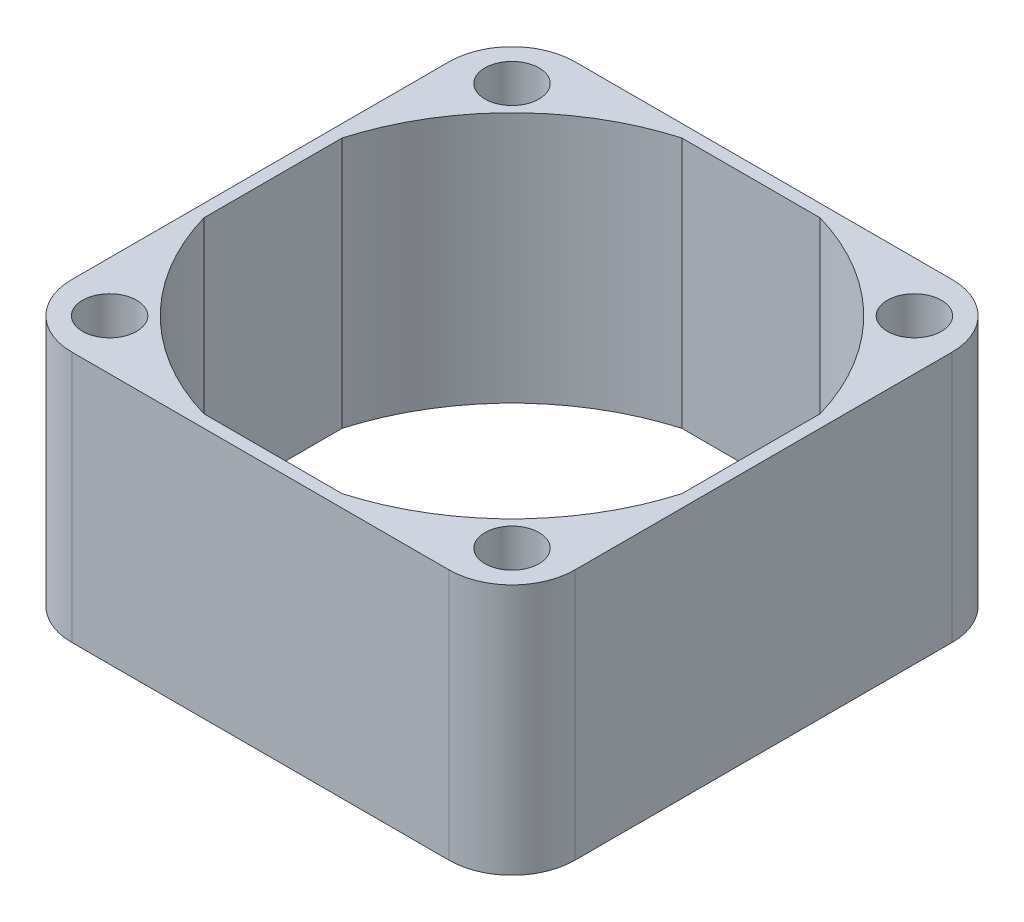
ISO-10303-21;
HEADER;
FILE_DESCRIPTION(('STEP AP214'),'2;1');
FILE_NAME('part.step','',(''),(''),'','','');
FILE_SCHEMA(('AUTOMOTIVE_DESIGN { 1 0 10303 214 1 1 1 1 }'));
ENDSEC;
DATA;
#1=APPLICATION_CONTEXT('core data for automotive mechanical design processes');
#2=APPLICATION_PROTOCOL_DEFINITION('international standard','automotive_design',2000,#1);
#3=PRODUCT_CONTEXT('',#1,'mechanical');
#4=PRODUCT('Part','Part','',(#3));
#5=PRODUCT_RELATED_PRODUCT_CATEGORY('part','',(#4));
#6=PRODUCT_DEFINITION_FORMATION('','',#4);
#7=PRODUCT_DEFINITION_CONTEXT('part definition',#1,'design');
#8=PRODUCT_DEFINITION('design','',#6,#7);
#9=PRODUCT_DEFINITION_SHAPE('','',#8);
#10=(LENGTH_UNIT() NAMED_UNIT(*) SI_UNIT(.MILLI.,.METRE.));
#11=(NAMED_UNIT(*) PLANE_ANGLE_UNIT() SI_UNIT($,.RADIAN.));
#12=(NAMED_UNIT(*) SI_UNIT($,.STERADIAN.) SOLID_ANGLE_UNIT());
#13=UNCERTAINTY_MEASURE_WITH_UNIT(LENGTH_MEASURE(1.E-05),#10,'distance_accuracy_value','');
#14=(GEOMETRIC_REPRESENTATION_CONTEXT(3) GLOBAL_UNCERTAINTY_ASSIGNED_CONTEXT((#13)) GLOBAL_UNIT_ASSIGNED_CONTEXT((#10,
#11,#12)) REPRESENTATION_CONTEXT('',''));
#15=CARTESIAN_POINT('',(0.,0.,0.));
#16=DIRECTION('',(0.,0.,1.));
#17=DIRECTION('',(1.,0.,0.));
#18=AXIS2_PLACEMENT_3D('',#15,#16,#17);
#19=CARTESIAN_POINT('',(0.,20.,0.));
#20=DIRECTION('',(0.,1.,0.));
#21=DIRECTION('',(0.,0.,1.));
#22=AXIS2_PLACEMENT_3D('',#19,#20,#21);
#23=PLANE('',#22);
#24=CARTESIAN_POINT('',(-16.,20.,16.));
#25=DIRECTION('',(0.,1.,0.));
#26=DIRECTION('',(0.,0.,1.));
#27=AXIS2_PLACEMENT_3D('',#24,#25,#26);
#28=CIRCLE('',#27,2.15);
#29=CARTESIAN_POINT('',(-16.,20.,18.15));
#30=VERTEX_POINT('',#29);
#31=EDGE_CURVE('E228',#30,#30,#28,.T.);
#32=ORIENTED_EDGE('',*,*,#31,.F.);
#33=EDGE_LOOP('',(#32));
#34=FACE_BOUND('',#33,.T.);
#35=CARTESIAN_POINT('',(16.,20.,-16.));
#36=DIRECTION('',(0.,1.,0.));
#37=DIRECTION('',(0.,0.,1.));
#38=AXIS2_PLACEMENT_3D('',#35,#36,#37);
#39=CIRCLE('',#38,2.15);
#40=CARTESIAN_POINT('',(16.,20.,-13.85));
#41=VERTEX_POINT('',#40);
#42=EDGE_CURVE('E240',#41,#41,#39,.T.);
#43=ORIENTED_EDGE('',*,*,#42,.F.);
#44=EDGE_LOOP('',(#43));
#45=FACE_BOUND('',#44,.T.);
#46=DIRECTION('',(0.,0.,1.));
#47=VECTOR('',#46,1.);
#48=CARTESIAN_POINT('',(-20.,20.,-20.));
#49=LINE('',#48,#47);
#50=CARTESIAN_POINT('',(-20.,20.,-15.));
#51=VERTEX_POINT('',#50);
#52=CARTESIAN_POINT('',(-20.,20.,15.));
#53=VERTEX_POINT('',#52);
#54=EDGE_CURVE('E251',#51,#53,#49,.T.);
#55=ORIENTED_EDGE('',*,*,#54,.T.);
#56=CARTESIAN_POINT('',(-15.,20.,15.));
#57=DIRECTION('',(0.,1.,0.));
#58=DIRECTION('',(0.,0.,1.));
#59=AXIS2_PLACEMENT_3D('',#56,#57,#58);
#60=CIRCLE('',#59,5.);
#61=CARTESIAN_POINT('',(-15.,20.,20.));
#62=VERTEX_POINT('',#61);
#63=EDGE_CURVE('E289',#53,#62,#60,.T.);
#64=ORIENTED_EDGE('',*,*,#63,.T.);
#65=DIRECTION('',(1.,0.,0.));
#66=VECTOR('',#65,1.);
#67=CARTESIAN_POINT('',(-20.,20.,20.));
#68=LINE('',#67,#66);
#69=CARTESIAN_POINT('',(15.,20.,20.));
#70=VERTEX_POINT('',#69);
#71=EDGE_CURVE('E254',#62,#70,#68,.T.);
#72=ORIENTED_EDGE('',*,*,#71,.T.);
#73=CARTESIAN_POINT('',(15.,20.,15.));
#74=DIRECTION('',(0.,1.,0.));
#75=DIRECTION('',(0.,0.,1.));
#76=AXIS2_PLACEMENT_3D('',#73,#74,#75);
#77=CIRCLE('',#76,5.);
#78=CARTESIAN_POINT('',(20.,20.,15.));
#79=VERTEX_POINT('',#78);
#80=EDGE_CURVE('E287',#70,#79,#77,.T.);
#81=ORIENTED_EDGE('',*,*,#80,.T.);
#82=DIRECTION('',(0.,0.,-1.));
#83=VECTOR('',#82,1.);
#84=CARTESIAN_POINT('',(20.,20.,-20.));
#85=LINE('',#84,#83);
#86=CARTESIAN_POINT('',(20.,20.,-15.));
#87=VERTEX_POINT('',#86);
#88=EDGE_CURVE('E246',#79,#87,#85,.T.);
#89=ORIENTED_EDGE('',*,*,#88,.T.);
#90=CARTESIAN_POINT('',(15.,20.,-15.));
#91=DIRECTION('',(0.,1.,0.));
#92=DIRECTION('',(0.,0.,1.));
#93=AXIS2_PLACEMENT_3D('',#90,#91,#92);
#94=CIRCLE('',#93,5.);
#95=CARTESIAN_POINT('',(15.,20.,-20.));
#96=VERTEX_POINT('',#95);
#97=EDGE_CURVE('E58',#87,#96,#94,.T.);
#98=ORIENTED_EDGE('',*,*,#97,.T.);
#99=DIRECTION('',(-1.,0.,0.));
#100=VECTOR('',#99,1.);
#101=CARTESIAN_POINT('',(-20.,20.,-20.));
#102=LINE('',#101,#100);
#103=CARTESIAN_POINT('',(-15.,20.,-20.));
#104=VERTEX_POINT('',#103);
#105=EDGE_CURVE('E248',#96,#104,#102,.T.);
#106=ORIENTED_EDGE('',*,*,#105,.T.);
#107=CARTESIAN_POINT('',(-15.,20.,-15.));
#108=DIRECTION('',(0.,1.,0.));
#109=DIRECTION('',(0.,0.,1.));
#110=AXIS2_PLACEMENT_3D('',#107,#108,#109);
#111=CIRCLE('',#110,5.);
#112=EDGE_CURVE('E284',#104,#51,#111,.T.);
#113=ORIENTED_EDGE('',*,*,#112,.T.);
#114=EDGE_LOOP('',(#55,#64,#72,#81,#89,#98,#106,#113));
#115=FACE_BOUND('',#114,.T.);
#116=CARTESIAN_POINT('',(16.,20.,16.));
#117=DIRECTION('',(0.,1.,0.));
#118=DIRECTION('',(0.,0.,1.));
#119=AXIS2_PLACEMENT_3D('',#116,#117,#118);
#120=CIRCLE('',#119,2.15);
#121=CARTESIAN_POINT('',(16.,20.,18.15));
#122=VERTEX_POINT('',#121);
#123=EDGE_CURVE('E234',#122,#122,#120,.T.);
#124=ORIENTED_EDGE('',*,*,#123,.F.);
#125=EDGE_LOOP('',(#124));
#126=FACE_BOUND('',#125,.T.);
#127=CARTESIAN_POINT('',(-16.,20.,-16.));
#128=DIRECTION('',(0.,1.,0.));
#129=DIRECTION('',(0.,0.,1.));
#130=AXIS2_PLACEMENT_3D('',#127,#128,#129);
#131=CIRCLE('',#130,2.15);
#132=CARTESIAN_POINT('',(-16.,20.,-13.85));
#133=VERTEX_POINT('',#132);
#134=EDGE_CURVE('E222',#133,#133,#131,.T.);
#135=ORIENTED_EDGE('',*,*,#134,.F.);
#136=EDGE_LOOP('',(#135));
#137=FACE_BOUND('',#136,.T.);
#138=DIRECTION('',(0.,0.,-1.));
#139=VECTOR('',#138,1.);
#140=CARTESIAN_POINT('',(19.,20.,-5.5));
#141=LINE('',#140,#139);
#142=CARTESIAN_POINT('',(19.,20.,5.5));
#143=VERTEX_POINT('',#142);
#144=CARTESIAN_POINT('',(19.,20.,-5.5));
#145=VERTEX_POINT('',#144);
#146=EDGE_CURVE('E162',#143,#145,#141,.T.);
#147=ORIENTED_EDGE('',*,*,#146,.F.);
#148=CARTESIAN_POINT('',(0.,20.,0.));
#149=DIRECTION('',(0.,1.,0.));
#150=DIRECTION('',(0.,0.,1.));
#151=AXIS2_PLACEMENT_3D('',#148,#149,#150);
#152=CIRCLE('',#151,19.7800404448525);
#153=CARTESIAN_POINT('',(5.50000000000001,20.,19.));
#154=VERTEX_POINT('',#153);
#155=EDGE_CURVE('E152',#154,#143,#152,.T.);
#156=ORIENTED_EDGE('',*,*,#155,.F.);
#157=DIRECTION('',(1.,0.,0.));
#158=VECTOR('',#157,1.);
#159=CARTESIAN_POINT('',(-5.50000000000002,20.,19.));
#160=LINE('',#159,#158);
#161=CARTESIAN_POINT('',(-5.50000000000002,20.,19.));
#162=VERTEX_POINT('',#161);
#163=EDGE_CURVE('E188',#162,#154,#160,.T.);
#164=ORIENTED_EDGE('',*,*,#163,.F.);
#165=CARTESIAN_POINT('',(0.,20.,0.));
#166=DIRECTION('',(0.,1.,0.));
#167=DIRECTION('',(0.,0.,1.));
#168=AXIS2_PLACEMENT_3D('',#165,#166,#167);
#169=CIRCLE('',#168,19.7800404448525);
#170=CARTESIAN_POINT('',(-19.,20.,5.50000000000001));
#171=VERTEX_POINT('',#170);
#172=EDGE_CURVE('E185',#171,#162,#169,.T.);
#173=ORIENTED_EDGE('',*,*,#172,.F.);
#174=DIRECTION('',(0.,0.,1.));
#175=VECTOR('',#174,1.);
#176=CARTESIAN_POINT('',(-19.,20.,-5.50000000000001));
#177=LINE('',#176,#175);
#178=CARTESIAN_POINT('',(-19.,20.,-5.50000000000001));
#179=VERTEX_POINT('',#178);
#180=EDGE_CURVE('E183',#179,#171,#177,.T.);
#181=ORIENTED_EDGE('',*,*,#180,.F.);
#182=CARTESIAN_POINT('',(0.,20.,0.));
#183=DIRECTION('',(0.,1.,0.));
#184=DIRECTION('',(0.,0.,1.));
#185=AXIS2_PLACEMENT_3D('',#182,#183,#184);
#186=CIRCLE('',#185,19.7800404448525);
#187=CARTESIAN_POINT('',(-5.50000000000001,20.,-19.));
#188=VERTEX_POINT('',#187);
#189=EDGE_CURVE('E181',#188,#179,#186,.T.);
#190=ORIENTED_EDGE('',*,*,#189,.F.);
#191=DIRECTION('',(-1.,0.,0.));
#192=VECTOR('',#191,1.);
#193=CARTESIAN_POINT('',(-5.50000000000002,20.,-19.));
#194=LINE('',#193,#192);
#195=CARTESIAN_POINT('',(5.50000000000001,20.,-19.));
#196=VERTEX_POINT('',#195);
#197=EDGE_CURVE('E177',#196,#188,#194,.T.);
#198=ORIENTED_EDGE('',*,*,#197,.F.);
#199=CARTESIAN_POINT('',(0.,20.,0.));
#200=DIRECTION('',(0.,1.,0.));
#201=DIRECTION('',(0.,0.,1.));
#202=AXIS2_PLACEMENT_3D('',#199,#200,#201);
#203=CIRCLE('',#202,19.7800404448525);
#204=EDGE_CURVE('E175',#145,#196,#203,.T.);
#205=ORIENTED_EDGE('',*,*,#204,.F.);
#206=EDGE_LOOP('',(#147,#156,#164,#173,#181,#190,#198,#205));
#207=FACE_BOUND('',#206,.T.);
#208=ADVANCED_FACE('F37',(#34,#45,#115,#126,#137,#207),#23,.T.);
#209=CARTESIAN_POINT('',(0.,0.,0.));
#210=DIRECTION('',(0.,1.,0.));
#211=DIRECTION('',(0.,0.,1.));
#212=AXIS2_PLACEMENT_3D('',#209,#210,#211);
#213=PLANE('',#212);
#214=CARTESIAN_POINT('',(-16.,0.,-16.));
#215=DIRECTION('',(0.,1.,0.));
#216=DIRECTION('',(0.,0.,1.));
#217=AXIS2_PLACEMENT_3D('',#214,#215,#216);
#218=CIRCLE('',#217,2.15);
#219=CARTESIAN_POINT('',(-16.,0.,-13.85));
#220=VERTEX_POINT('',#219);
#221=EDGE_CURVE('E170',#220,#220,#218,.T.);
#222=ORIENTED_EDGE('',*,*,#221,.T.);
#223=EDGE_LOOP('',(#222));
#224=FACE_BOUND('',#223,.T.);
#225=CARTESIAN_POINT('',(-16.,0.,16.));
#226=DIRECTION('',(0.,1.,0.));
#227=DIRECTION('',(0.,0.,1.));
#228=AXIS2_PLACEMENT_3D('',#225,#226,#227);
#229=CIRCLE('',#228,2.15);
#230=CARTESIAN_POINT('',(-16.,0.,18.15));
#231=VERTEX_POINT('',#230);
#232=EDGE_CURVE('E225',#231,#231,#229,.T.);
#233=ORIENTED_EDGE('',*,*,#232,.T.);
#234=EDGE_LOOP('',(#233));
#235=FACE_BOUND('',#234,.T.);
#236=CARTESIAN_POINT('',(16.,0.,16.));
#237=DIRECTION('',(0.,1.,0.));
#238=DIRECTION('',(0.,0.,1.));
#239=AXIS2_PLACEMENT_3D('',#236,#237,#238);
#240=CIRCLE('',#239,2.15);
#241=CARTESIAN_POINT('',(16.,0.,18.15));
#242=VERTEX_POINT('',#241);
#243=EDGE_CURVE('E231',#242,#242,#240,.T.);
#244=ORIENTED_EDGE('',*,*,#243,.T.);
#245=EDGE_LOOP('',(#244));
#246=FACE_BOUND('',#245,.T.);
#247=CARTESIAN_POINT('',(16.,0.,-16.));
#248=DIRECTION('',(0.,1.,0.));
#249=DIRECTION('',(0.,0.,1.));
#250=AXIS2_PLACEMENT_3D('',#247,#248,#249);
#251=CIRCLE('',#250,2.15);
#252=CARTESIAN_POINT('',(16.,0.,-13.85));
#253=VERTEX_POINT('',#252);
#254=EDGE_CURVE('E237',#253,#253,#251,.T.);
#255=ORIENTED_EDGE('',*,*,#254,.T.);
#256=EDGE_LOOP('',(#255));
#257=FACE_BOUND('',#256,.T.);
#258=DIRECTION('',(1.,0.,0.));
#259=VECTOR('',#258,1.);
#260=CARTESIAN_POINT('',(-20.,0.,20.));
#261=LINE('',#260,#259);
#262=CARTESIAN_POINT('',(-15.,0.,20.));
#263=VERTEX_POINT('',#262);
#264=CARTESIAN_POINT('',(15.,0.,20.));
#265=VERTEX_POINT('',#264);
#266=EDGE_CURVE('E249',#263,#265,#261,.T.);
#267=ORIENTED_EDGE('',*,*,#266,.F.);
#268=CARTESIAN_POINT('',(-15.,0.,15.));
#269=DIRECTION('',(0.,1.,0.));
#270=DIRECTION('',(0.,0.,1.));
#271=AXIS2_PLACEMENT_3D('',#268,#269,#270);
#272=CIRCLE('',#271,5.);
#273=CARTESIAN_POINT('',(-20.,0.,15.));
#274=VERTEX_POINT('',#273);
#275=EDGE_CURVE('E277',#263,#274,#272,.F.);
#276=ORIENTED_EDGE('',*,*,#275,.T.);
#277=DIRECTION('',(0.,0.,1.));
#278=VECTOR('',#277,1.);
#279=CARTESIAN_POINT('',(-20.,0.,-20.));
#280=LINE('',#279,#278);
#281=CARTESIAN_POINT('',(-20.,0.,-15.));
#282=VERTEX_POINT('',#281);
#283=EDGE_CURVE('E262',#282,#274,#280,.T.);
#284=ORIENTED_EDGE('',*,*,#283,.F.);
#285=CARTESIAN_POINT('',(-15.,0.,-15.));
#286=DIRECTION('',(0.,1.,0.));
#287=DIRECTION('',(0.,0.,1.));
#288=AXIS2_PLACEMENT_3D('',#285,#286,#287);
#289=CIRCLE('',#288,5.);
#290=CARTESIAN_POINT('',(-15.,0.,-20.));
#291=VERTEX_POINT('',#290);
#292=EDGE_CURVE('E271',#282,#291,#289,.F.);
#293=ORIENTED_EDGE('',*,*,#292,.T.);
#294=DIRECTION('',(-1.,0.,0.));
#295=VECTOR('',#294,1.);
#296=CARTESIAN_POINT('',(-20.,0.,-20.));
#297=LINE('',#296,#295);
#298=CARTESIAN_POINT('',(15.,0.,-20.));
#299=VERTEX_POINT('',#298);
#300=EDGE_CURVE('E260',#299,#291,#297,.T.);
#301=ORIENTED_EDGE('',*,*,#300,.F.);
#302=CARTESIAN_POINT('',(15.,0.,-15.));
#303=DIRECTION('',(0.,1.,0.));
#304=DIRECTION('',(0.,0.,1.));
#305=AXIS2_PLACEMENT_3D('',#302,#303,#304);
#306=CIRCLE('',#305,5.);
#307=CARTESIAN_POINT('',(20.,0.,-15.));
#308=VERTEX_POINT('',#307);
#309=EDGE_CURVE('E273',#299,#308,#306,.F.);
#310=ORIENTED_EDGE('',*,*,#309,.T.);
#311=DIRECTION('',(0.,0.,-1.));
#312=VECTOR('',#311,1.);
#313=CARTESIAN_POINT('',(20.,0.,-20.));
#314=LINE('',#313,#312);
#315=CARTESIAN_POINT('',(20.,0.,15.));
#316=VERTEX_POINT('',#315);
#317=EDGE_CURVE('E243',#316,#308,#314,.T.);
#318=ORIENTED_EDGE('',*,*,#317,.F.);
#319=CARTESIAN_POINT('',(15.,0.,15.));
#320=DIRECTION('',(0.,1.,0.));
#321=DIRECTION('',(0.,0.,1.));
#322=AXIS2_PLACEMENT_3D('',#319,#320,#321);
#323=CIRCLE('',#322,5.);
#324=EDGE_CURVE('E275',#316,#265,#323,.F.);
#325=ORIENTED_EDGE('',*,*,#324,.T.);
#326=EDGE_LOOP('',(#267,#276,#284,#293,#301,#310,#318,#325));
#327=FACE_BOUND('',#326,.T.);
#328=CARTESIAN_POINT('',(0.,0.,0.));
#329=DIRECTION('',(0.,1.,0.));
#330=DIRECTION('',(0.,0.,1.));
#331=AXIS2_PLACEMENT_3D('',#328,#329,#330);
#332=CIRCLE('',#331,19.7800404448525);
#333=CARTESIAN_POINT('',(5.50000000000001,0.,19.));
#334=VERTEX_POINT('',#333);
#335=CARTESIAN_POINT('',(19.,0.,5.5));
#336=VERTEX_POINT('',#335);
#337=EDGE_CURVE('E190',#334,#336,#332,.T.);
#338=ORIENTED_EDGE('',*,*,#337,.T.);
#339=DIRECTION('',(0.,0.,-1.));
#340=VECTOR('',#339,1.);
#341=CARTESIAN_POINT('',(19.,0.,-5.5));
#342=LINE('',#341,#340);
#343=CARTESIAN_POINT('',(19.,0.,-5.5));
#344=VERTEX_POINT('',#343);
#345=EDGE_CURVE('E169',#336,#344,#342,.T.);
#346=ORIENTED_EDGE('',*,*,#345,.T.);
#347=CARTESIAN_POINT('',(0.,0.,0.));
#348=DIRECTION('',(0.,1.,0.));
#349=DIRECTION('',(0.,0.,1.));
#350=AXIS2_PLACEMENT_3D('',#347,#348,#349);
#351=CIRCLE('',#350,19.7800404448525);
#352=CARTESIAN_POINT('',(5.50000000000001,0.,-19.));
#353=VERTEX_POINT('',#352);
#354=EDGE_CURVE('E193',#344,#353,#351,.T.);
#355=ORIENTED_EDGE('',*,*,#354,.T.);
#356=DIRECTION('',(-1.,0.,0.));
#357=VECTOR('',#356,1.);
#358=CARTESIAN_POINT('',(-5.50000000000002,0.,-19.));
#359=LINE('',#358,#357);
#360=CARTESIAN_POINT('',(-5.50000000000001,0.,-19.));
#361=VERTEX_POINT('',#360);
#362=EDGE_CURVE('E196',#353,#361,#359,.T.);
#363=ORIENTED_EDGE('',*,*,#362,.T.);
#364=CARTESIAN_POINT('',(0.,0.,0.));
#365=DIRECTION('',(0.,1.,0.));
#366=DIRECTION('',(0.,0.,1.));
#367=AXIS2_PLACEMENT_3D('',#364,#365,#366);
#368=CIRCLE('',#367,19.7800404448525);
#369=CARTESIAN_POINT('',(-19.,0.,-5.50000000000001));
#370=VERTEX_POINT('',#369);
#371=EDGE_CURVE('E199',#361,#370,#368,.T.);
#372=ORIENTED_EDGE('',*,*,#371,.T.);
#373=DIRECTION('',(0.,0.,1.));
#374=VECTOR('',#373,1.);
#375=CARTESIAN_POINT('',(-19.,0.,-5.50000000000001));
#376=LINE('',#375,#374);
#377=CARTESIAN_POINT('',(-19.,0.,5.50000000000001));
#378=VERTEX_POINT('',#377);
#379=EDGE_CURVE('E202',#370,#378,#376,.T.);
#380=ORIENTED_EDGE('',*,*,#379,.T.);
#381=CARTESIAN_POINT('',(0.,0.,0.));
#382=DIRECTION('',(0.,1.,0.));
#383=DIRECTION('',(0.,0.,1.));
#384=AXIS2_PLACEMENT_3D('',#381,#382,#383);
#385=CIRCLE('',#384,19.7800404448525);
#386=CARTESIAN_POINT('',(-5.50000000000002,0.,19.));
#387=VERTEX_POINT('',#386);
#388=EDGE_CURVE('E205',#378,#387,#385,.T.);
#389=ORIENTED_EDGE('',*,*,#388,.T.);
#390=DIRECTION('',(1.,0.,0.));
#391=VECTOR('',#390,1.);
#392=CARTESIAN_POINT('',(-5.50000000000002,0.,19.));
#393=LINE('',#392,#391);
#394=EDGE_CURVE('E163',#387,#334,#393,.T.);
#395=ORIENTED_EDGE('',*,*,#394,.T.);
#396=EDGE_LOOP('',(#338,#346,#355,#363,#372,#380,#389,#395));
#397=FACE_BOUND('',#396,.T.);
#398=ADVANCED_FACE('F305',(#224,#235,#246,#257,#327,#397),#213,.F.);
#399=CARTESIAN_POINT('',(20.,20.,-20.));
#400=DIRECTION('',(-1.,0.,0.));
#401=DIRECTION('',(0.,0.,1.));
#402=AXIS2_PLACEMENT_3D('',#399,#400,#401);
#403=PLANE('',#402);
#404=ORIENTED_EDGE('',*,*,#88,.F.);
#405=DIRECTION('',(0.,-1.,0.));
#406=VECTOR('',#405,1.);
#407=CARTESIAN_POINT('',(20.,20.,15.));
#408=LINE('',#407,#406);
#409=EDGE_CURVE('E293',#79,#316,#408,.T.);
#410=ORIENTED_EDGE('',*,*,#409,.T.);
#411=ORIENTED_EDGE('',*,*,#317,.T.);
#412=DIRECTION('',(0.,-1.,0.));
#413=VECTOR('',#412,1.);
#414=CARTESIAN_POINT('',(20.,20.,-15.));
#415=LINE('',#414,#413);
#416=EDGE_CURVE('E291',#308,#87,#415,.F.);
#417=ORIENTED_EDGE('',*,*,#416,.T.);
#418=EDGE_LOOP('',(#404,#410,#411,#417));
#419=FACE_BOUND('',#418,.T.);
#420=ADVANCED_FACE('F299',(#419),#403,.F.);
#421=CARTESIAN_POINT('',(-20.,20.,-20.));
#422=DIRECTION('',(0.,0.,1.));
#423=DIRECTION('',(1.,0.,0.));
#424=AXIS2_PLACEMENT_3D('',#421,#422,#423);
#425=PLANE('',#424);
#426=ORIENTED_EDGE('',*,*,#105,.F.);
#427=DIRECTION('',(0.,-1.,0.));
#428=VECTOR('',#427,1.);
#429=CARTESIAN_POINT('',(15.,20.,-20.));
#430=LINE('',#429,#428);
#431=EDGE_CURVE('E11',#96,#299,#430,.T.);
#432=ORIENTED_EDGE('',*,*,#431,.T.);
#433=ORIENTED_EDGE('',*,*,#300,.T.);
#434=DIRECTION('',(0.,-1.,0.));
#435=VECTOR('',#434,1.);
#436=CARTESIAN_POINT('',(-15.,20.,-20.));
#437=LINE('',#436,#435);
#438=EDGE_CURVE('E45',#291,#104,#437,.F.);
#439=ORIENTED_EDGE('',*,*,#438,.T.);
#440=EDGE_LOOP('',(#426,#432,#433,#439));
#441=FACE_BOUND('',#440,.T.);
#442=ADVANCED_FACE('F311',(#441),#425,.F.);
#443=CARTESIAN_POINT('',(-20.,20.,-20.));
#444=DIRECTION('',(1.,0.,0.));
#445=DIRECTION('',(0.,0.,-1.));
#446=AXIS2_PLACEMENT_3D('',#443,#444,#445);
#447=PLANE('',#446);
#448=ORIENTED_EDGE('',*,*,#283,.T.);
#449=DIRECTION('',(0.,-1.,0.));
#450=VECTOR('',#449,1.);
#451=CARTESIAN_POINT('',(-20.,20.,15.));
#452=LINE('',#451,#450);
#453=EDGE_CURVE('E282',#274,#53,#452,.F.);
#454=ORIENTED_EDGE('',*,*,#453,.T.);
#455=ORIENTED_EDGE('',*,*,#54,.F.);
#456=DIRECTION('',(0.,-1.,0.));
#457=VECTOR('',#456,1.);
#458=CARTESIAN_POINT('',(-20.,20.,-15.));
#459=LINE('',#458,#457);
#460=EDGE_CURVE('E279',#51,#282,#459,.T.);
#461=ORIENTED_EDGE('',*,*,#460,.T.);
#462=EDGE_LOOP('',(#448,#454,#455,#461));
#463=FACE_BOUND('',#462,.T.);
#464=ADVANCED_FACE('F319',(#463),#447,.F.);
#465=CARTESIAN_POINT('',(-20.,20.,20.));
#466=DIRECTION('',(0.,0.,-1.));
#467=DIRECTION('',(-1.,0.,0.));
#468=AXIS2_PLACEMENT_3D('',#465,#466,#467);
#469=PLANE('',#468);
#470=ORIENTED_EDGE('',*,*,#71,.F.);
#471=DIRECTION('',(0.,-1.,0.));
#472=VECTOR('',#471,1.);
#473=CARTESIAN_POINT('',(-15.,20.,20.));
#474=LINE('',#473,#472);
#475=EDGE_CURVE('E268',#62,#263,#474,.T.);
#476=ORIENTED_EDGE('',*,*,#475,.T.);
#477=ORIENTED_EDGE('',*,*,#266,.T.);
#478=DIRECTION('',(0.,-1.,0.));
#479=VECTOR('',#478,1.);
#480=CARTESIAN_POINT('',(15.,20.,20.));
#481=LINE('',#480,#479);
#482=EDGE_CURVE('E257',#265,#70,#481,.F.);
#483=ORIENTED_EDGE('',*,*,#482,.T.);
#484=EDGE_LOOP('',(#470,#476,#477,#483));
#485=FACE_BOUND('',#484,.T.);
#486=ADVANCED_FACE('F327',(#485),#469,.F.);
#487=CARTESIAN_POINT('',(16.,20.,-16.));
#488=DIRECTION('',(0.,-1.,0.));
#489=DIRECTION('',(0.,0.,-1.));
#490=AXIS2_PLACEMENT_3D('',#487,#488,#489);
#491=CYLINDRICAL_SURFACE('',#490,2.15);
#492=ORIENTED_EDGE('',*,*,#42,.T.);
#493=EDGE_LOOP('',(#492));
#494=FACE_BOUND('',#493,.T.);
#495=ORIENTED_EDGE('',*,*,#254,.F.);
#496=EDGE_LOOP('',(#495));
#497=FACE_BOUND('',#496,.T.);
#498=ADVANCED_FACE('F349',(#494,#497),#491,.F.);
#499=CARTESIAN_POINT('',(16.,20.,16.));
#500=DIRECTION('',(0.,-1.,0.));
#501=DIRECTION('',(0.,0.,-1.));
#502=AXIS2_PLACEMENT_3D('',#499,#500,#501);
#503=CYLINDRICAL_SURFACE('',#502,2.15);
#504=ORIENTED_EDGE('',*,*,#123,.T.);
#505=EDGE_LOOP('',(#504));
#506=FACE_BOUND('',#505,.T.);
#507=ORIENTED_EDGE('',*,*,#243,.F.);
#508=EDGE_LOOP('',(#507));
#509=FACE_BOUND('',#508,.T.);
#510=ADVANCED_FACE('F382',(#506,#509),#503,.F.);
#511=CARTESIAN_POINT('',(-16.,20.,16.));
#512=DIRECTION('',(0.,-1.,0.));
#513=DIRECTION('',(0.,0.,-1.));
#514=AXIS2_PLACEMENT_3D('',#511,#512,#513);
#515=CYLINDRICAL_SURFACE('',#514,2.15);
#516=ORIENTED_EDGE('',*,*,#31,.T.);
#517=EDGE_LOOP('',(#516));
#518=FACE_BOUND('',#517,.T.);
#519=ORIENTED_EDGE('',*,*,#232,.F.);
#520=EDGE_LOOP('',(#519));
#521=FACE_BOUND('',#520,.T.);
#522=ADVANCED_FACE('F389',(#518,#521),#515,.F.);
#523=CARTESIAN_POINT('',(-16.,20.,-16.));
#524=DIRECTION('',(0.,-1.,0.));
#525=DIRECTION('',(0.,0.,-1.));
#526=AXIS2_PLACEMENT_3D('',#523,#524,#525);
#527=CYLINDRICAL_SURFACE('',#526,2.15);
#528=ORIENTED_EDGE('',*,*,#134,.T.);
#529=EDGE_LOOP('',(#528));
#530=FACE_BOUND('',#529,.T.);
#531=ORIENTED_EDGE('',*,*,#221,.F.);
#532=EDGE_LOOP('',(#531));
#533=FACE_BOUND('',#532,.T.);
#534=ADVANCED_FACE('F396',(#530,#533),#527,.F.);
#535=CARTESIAN_POINT('',(0.,20.,0.));
#536=DIRECTION('',(0.,-1.,0.));
#537=DIRECTION('',(0.,0.,-1.));
#538=AXIS2_PLACEMENT_3D('',#535,#536,#537);
#539=CYLINDRICAL_SURFACE('',#538,19.7800404448525);
#540=ORIENTED_EDGE('',*,*,#337,.F.);
#541=DIRECTION('',(0.,-1.,0.));
#542=VECTOR('',#541,1.);
#543=CARTESIAN_POINT('',(5.50000000000001,20.,19.));
#544=LINE('',#543,#542);
#545=EDGE_CURVE('E158',#154,#334,#544,.T.);
#546=ORIENTED_EDGE('',*,*,#545,.F.);
#547=ORIENTED_EDGE('',*,*,#155,.T.);
#548=DIRECTION('',(0.,-1.,0.));
#549=VECTOR('',#548,1.);
#550=CARTESIAN_POINT('',(19.,20.,5.5));
#551=LINE('',#550,#549);
#552=EDGE_CURVE('E155',#143,#336,#551,.T.);
#553=ORIENTED_EDGE('',*,*,#552,.T.);
#554=EDGE_LOOP('',(#540,#546,#547,#553));
#555=FACE_BOUND('',#554,.T.);
#556=ADVANCED_FACE('F154',(#555),#539,.F.);
#557=CARTESIAN_POINT('',(19.,20.,-5.5));
#558=DIRECTION('',(-1.,0.,0.));
#559=DIRECTION('',(0.,0.,1.));
#560=AXIS2_PLACEMENT_3D('',#557,#558,#559);
#561=PLANE('',#560);
#562=ORIENTED_EDGE('',*,*,#345,.F.);
#563=ORIENTED_EDGE('',*,*,#552,.F.);
#564=ORIENTED_EDGE('',*,*,#146,.T.);
#565=DIRECTION('',(0.,-1.,0.));
#566=VECTOR('',#565,1.);
#567=CARTESIAN_POINT('',(19.,20.,-5.5));
#568=LINE('',#567,#566);
#569=EDGE_CURVE('E171',#145,#344,#568,.T.);
#570=ORIENTED_EDGE('',*,*,#569,.T.);
#571=EDGE_LOOP('',(#562,#563,#564,#570));
#572=FACE_BOUND('',#571,.T.);
#573=ADVANCED_FACE('F166',(#572),#561,.T.);
#574=CARTESIAN_POINT('',(0.,20.,0.));
#575=DIRECTION('',(0.,-1.,0.));
#576=DIRECTION('',(0.,0.,-1.));
#577=AXIS2_PLACEMENT_3D('',#574,#575,#576);
#578=CYLINDRICAL_SURFACE('',#577,19.7800404448525);
#579=ORIENTED_EDGE('',*,*,#354,.F.);
#580=ORIENTED_EDGE('',*,*,#569,.F.);
#581=ORIENTED_EDGE('',*,*,#204,.T.);
#582=DIRECTION('',(0.,-1.,0.));
#583=VECTOR('',#582,1.);
#584=CARTESIAN_POINT('',(5.50000000000001,20.,-19.));
#585=LINE('',#584,#583);
#586=EDGE_CURVE('E219',#196,#353,#585,.T.);
#587=ORIENTED_EDGE('',*,*,#586,.T.);
#588=EDGE_LOOP('',(#579,#580,#581,#587));
#589=FACE_BOUND('',#588,.T.);
#590=ADVANCED_FACE('F417',(#589),#578,.F.);
#591=CARTESIAN_POINT('',(-5.50000000000002,20.,-19.));
#592=DIRECTION('',(0.,0.,1.));
#593=DIRECTION('',(1.,0.,0.));
#594=AXIS2_PLACEMENT_3D('',#591,#592,#593);
#595=PLANE('',#594);
#596=ORIENTED_EDGE('',*,*,#362,.F.);
#597=ORIENTED_EDGE('',*,*,#586,.F.);
#598=ORIENTED_EDGE('',*,*,#197,.T.);
#599=DIRECTION('',(0.,-1.,0.));
#600=VECTOR('',#599,1.);
#601=CARTESIAN_POINT('',(-5.50000000000001,20.,-19.));
#602=LINE('',#601,#600);
#603=EDGE_CURVE('E217',#188,#361,#602,.T.);
#604=ORIENTED_EDGE('',*,*,#603,.T.);
#605=EDGE_LOOP('',(#596,#597,#598,#604));
#606=FACE_BOUND('',#605,.T.);
#607=ADVANCED_FACE('F424',(#606),#595,.T.);
#608=CARTESIAN_POINT('',(0.,20.,0.));
#609=DIRECTION('',(0.,-1.,0.));
#610=DIRECTION('',(0.,0.,-1.));
#611=AXIS2_PLACEMENT_3D('',#608,#609,#610);
#612=CYLINDRICAL_SURFACE('',#611,19.7800404448525);
#613=ORIENTED_EDGE('',*,*,#371,.F.);
#614=ORIENTED_EDGE('',*,*,#603,.F.);
#615=ORIENTED_EDGE('',*,*,#189,.T.);
#616=DIRECTION('',(0.,-1.,0.));
#617=VECTOR('',#616,1.);
#618=CARTESIAN_POINT('',(-19.,20.,-5.50000000000001));
#619=LINE('',#618,#617);
#620=EDGE_CURVE('E215',#179,#370,#619,.T.);
#621=ORIENTED_EDGE('',*,*,#620,.T.);
#622=EDGE_LOOP('',(#613,#614,#615,#621));
#623=FACE_BOUND('',#622,.T.);
#624=ADVANCED_FACE('F432',(#623),#612,.F.);
#625=CARTESIAN_POINT('',(-19.,20.,-5.50000000000001));
#626=DIRECTION('',(1.,0.,0.));
#627=DIRECTION('',(0.,0.,-1.));
#628=AXIS2_PLACEMENT_3D('',#625,#626,#627);
#629=PLANE('',#628);
#630=ORIENTED_EDGE('',*,*,#379,.F.);
#631=ORIENTED_EDGE('',*,*,#620,.F.);
#632=ORIENTED_EDGE('',*,*,#180,.T.);
#633=DIRECTION('',(0.,-1.,0.));
#634=VECTOR('',#633,1.);
#635=CARTESIAN_POINT('',(-19.,20.,5.50000000000001));
#636=LINE('',#635,#634);
#637=EDGE_CURVE('E213',#171,#378,#636,.T.);
#638=ORIENTED_EDGE('',*,*,#637,.T.);
#639=EDGE_LOOP('',(#630,#631,#632,#638));
#640=FACE_BOUND('',#639,.T.);
#641=ADVANCED_FACE('F440',(#640),#629,.T.);
#642=CARTESIAN_POINT('',(0.,20.,0.));
#643=DIRECTION('',(0.,-1.,0.));
#644=DIRECTION('',(0.,0.,-1.));
#645=AXIS2_PLACEMENT_3D('',#642,#643,#644);
#646=CYLINDRICAL_SURFACE('',#645,19.7800404448525);
#647=ORIENTED_EDGE('',*,*,#388,.F.);
#648=ORIENTED_EDGE('',*,*,#637,.F.);
#649=ORIENTED_EDGE('',*,*,#172,.T.);
#650=DIRECTION('',(0.,-1.,0.));
#651=VECTOR('',#650,1.);
#652=CARTESIAN_POINT('',(-5.50000000000002,20.,19.));
#653=LINE('',#652,#651);
#654=EDGE_CURVE('E211',#162,#387,#653,.T.);
#655=ORIENTED_EDGE('',*,*,#654,.T.);
#656=EDGE_LOOP('',(#647,#648,#649,#655));
#657=FACE_BOUND('',#656,.T.);
#658=ADVANCED_FACE('F448',(#657),#646,.F.);
#659=CARTESIAN_POINT('',(-5.50000000000002,20.,19.));
#660=DIRECTION('',(0.,0.,-1.));
#661=DIRECTION('',(-1.,0.,0.));
#662=AXIS2_PLACEMENT_3D('',#659,#660,#661);
#663=PLANE('',#662);
#664=ORIENTED_EDGE('',*,*,#394,.F.);
#665=ORIENTED_EDGE('',*,*,#654,.F.);
#666=ORIENTED_EDGE('',*,*,#163,.T.);
#667=ORIENTED_EDGE('',*,*,#545,.T.);
#668=EDGE_LOOP('',(#664,#665,#666,#667));
#669=FACE_BOUND('',#668,.T.);
#670=ADVANCED_FACE('F336',(#669),#663,.T.);
#671=CARTESIAN_POINT('',(-15.,20.,15.));
#672=DIRECTION('',(0.,-1.,0.));
#673=DIRECTION('',(0.,0.,-1.));
#674=AXIS2_PLACEMENT_3D('',#671,#672,#673);
#675=CYLINDRICAL_SURFACE('',#674,5.);
#676=ORIENTED_EDGE('',*,*,#63,.F.);
#677=ORIENTED_EDGE('',*,*,#453,.F.);
#678=ORIENTED_EDGE('',*,*,#275,.F.);
#679=ORIENTED_EDGE('',*,*,#475,.F.);
#680=EDGE_LOOP('',(#676,#677,#678,#679));
#681=FACE_BOUND('',#680,.T.);
#682=ADVANCED_FACE('F324',(#681),#675,.T.);
#683=CARTESIAN_POINT('',(15.,20.,15.));
#684=DIRECTION('',(0.,-1.,0.));
#685=DIRECTION('',(0.,0.,-1.));
#686=AXIS2_PLACEMENT_3D('',#683,#684,#685);
#687=CYLINDRICAL_SURFACE('',#686,5.);
#688=ORIENTED_EDGE('',*,*,#80,.F.);
#689=ORIENTED_EDGE('',*,*,#482,.F.);
#690=ORIENTED_EDGE('',*,*,#324,.F.);
#691=ORIENTED_EDGE('',*,*,#409,.F.);
#692=EDGE_LOOP('',(#688,#689,#690,#691));
#693=FACE_BOUND('',#692,.T.);
#694=ADVANCED_FACE('F329',(#693),#687,.T.);
#695=CARTESIAN_POINT('',(15.,20.,-15.));
#696=DIRECTION('',(0.,-1.,0.));
#697=DIRECTION('',(0.,0.,-1.));
#698=AXIS2_PLACEMENT_3D('',#695,#696,#697);
#699=CYLINDRICAL_SURFACE('',#698,5.);
#700=ORIENTED_EDGE('',*,*,#97,.F.);
#701=ORIENTED_EDGE('',*,*,#416,.F.);
#702=ORIENTED_EDGE('',*,*,#309,.F.);
#703=ORIENTED_EDGE('',*,*,#431,.F.);
#704=EDGE_LOOP('',(#700,#701,#702,#703));
#705=FACE_BOUND('',#704,.T.);
#706=ADVANCED_FACE('F310',(#705),#699,.T.);
#707=CARTESIAN_POINT('',(-15.,20.,-15.));
#708=DIRECTION('',(0.,-1.,0.));
#709=DIRECTION('',(0.,0.,-1.));
#710=AXIS2_PLACEMENT_3D('',#707,#708,#709);
#711=CYLINDRICAL_SURFACE('',#710,5.);
#712=ORIENTED_EDGE('',*,*,#112,.F.);
#713=ORIENTED_EDGE('',*,*,#438,.F.);
#714=ORIENTED_EDGE('',*,*,#292,.F.);
#715=ORIENTED_EDGE('',*,*,#460,.F.);
#716=EDGE_LOOP('',(#712,#713,#714,#715));
#717=FACE_BOUND('',#716,.T.);
#718=ADVANCED_FACE('F39',(#717),#711,.T.);
#719=CLOSED_SHELL('',(#208,#398,#420,#442,#464,#486,#498,#510,#522,#534,#556,#573,#590,#607,
#624,#641,#658,#670,#682,#694,#706,#718));
#720=MANIFOLD_SOLID_BREP('B2',#719);
#721=ADVANCED_BREP_SHAPE_REPRESENTATION('',(#18,#720),#14);
#722=SHAPE_DEFINITION_REPRESENTATION(#9,#721);
ENDSEC;
END-ISO-10303-21;
